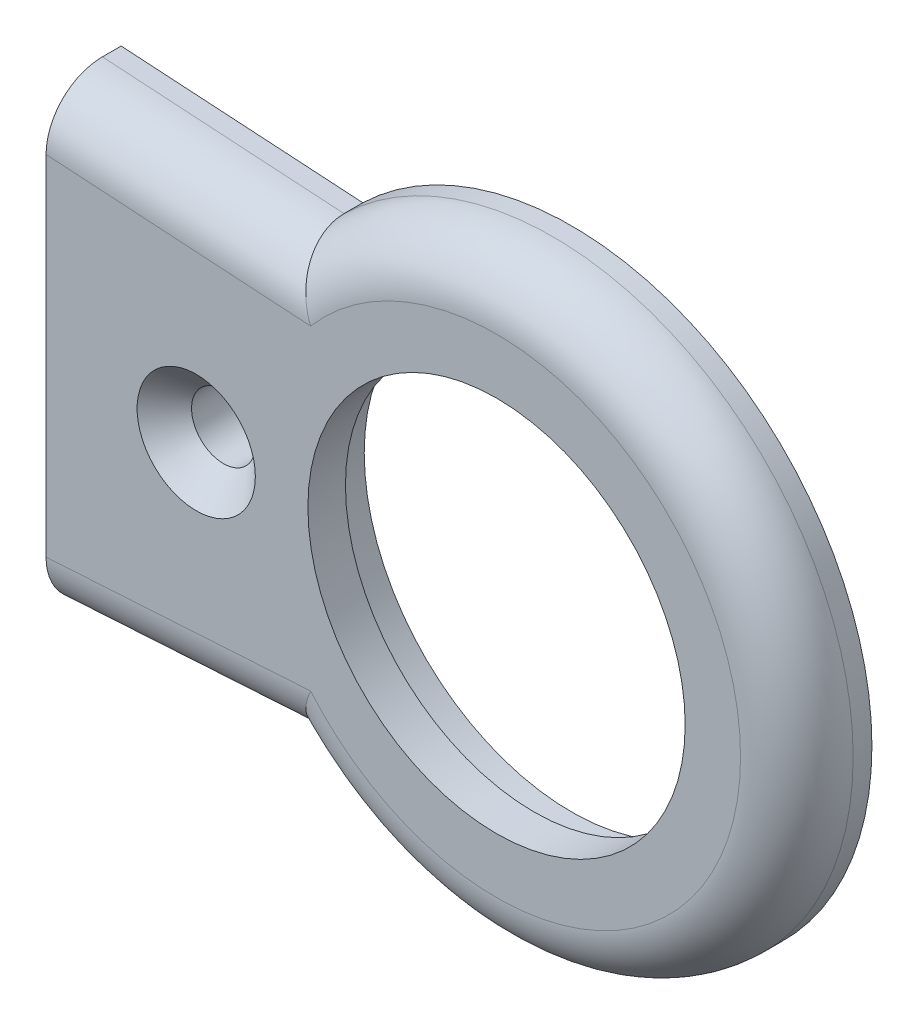
ISO-10303-21;
HEADER;
FILE_DESCRIPTION(('STEP AP214'),'2;1');
FILE_NAME('part.step','',(''),(''),'','','');
FILE_SCHEMA(('AUTOMOTIVE_DESIGN { 1 0 10303 214 1 1 1 1 }'));
ENDSEC;
DATA;
#1=APPLICATION_CONTEXT('core data for automotive mechanical design processes');
#2=APPLICATION_PROTOCOL_DEFINITION('international standard','automotive_design',2000,#1);
#3=PRODUCT_CONTEXT('',#1,'mechanical');
#4=PRODUCT('Part','Part','',(#3));
#5=PRODUCT_RELATED_PRODUCT_CATEGORY('part','',(#4));
#6=PRODUCT_DEFINITION_FORMATION('','',#4);
#7=PRODUCT_DEFINITION_CONTEXT('part definition',#1,'design');
#8=PRODUCT_DEFINITION('design','',#6,#7);
#9=PRODUCT_DEFINITION_SHAPE('','',#8);
#10=(LENGTH_UNIT() NAMED_UNIT(*) SI_UNIT(.MILLI.,.METRE.));
#11=(NAMED_UNIT(*) PLANE_ANGLE_UNIT() SI_UNIT($,.RADIAN.));
#12=(NAMED_UNIT(*) SI_UNIT($,.STERADIAN.) SOLID_ANGLE_UNIT());
#13=UNCERTAINTY_MEASURE_WITH_UNIT(LENGTH_MEASURE(1.E-05),#10,'distance_accuracy_value','');
#14=(GEOMETRIC_REPRESENTATION_CONTEXT(3) GLOBAL_UNCERTAINTY_ASSIGNED_CONTEXT((#13)) GLOBAL_UNIT_ASSIGNED_CONTEXT((#10,
#11,#12)) REPRESENTATION_CONTEXT('',''));
#15=CARTESIAN_POINT('',(0.,0.,0.));
#16=DIRECTION('',(0.,0.,1.));
#17=DIRECTION('',(1.,0.,0.));
#18=AXIS2_PLACEMENT_3D('',#15,#16,#17);
#19=CARTESIAN_POINT('',(141.,-21.1790926800229,7.00000000000001));
#20=DIRECTION('',(-1.,0.,0.));
#21=DIRECTION('',(0.,0.,1.));
#22=AXIS2_PLACEMENT_3D('',#19,#20,#21);
#23=PLANE('',#22);
#24=DIRECTION('',(0.,1.,0.));
#25=VECTOR('',#24,1.);
#26=CARTESIAN_POINT('',(141.,-21.1790926800229,7.00000000000001));
#27=LINE('',#26,#25);
#28=CARTESIAN_POINT('',(141.,-12.2949219386487,7.00000000000001));
#29=VERTEX_POINT('',#28);
#30=CARTESIAN_POINT('',(141.,12.2949219386487,7.00000000000001));
#31=VERTEX_POINT('',#30);
#32=EDGE_CURVE('E11',#29,#31,#27,.T.);
#33=ORIENTED_EDGE('',*,*,#32,.F.);
#34=DIRECTION('',(0.,0.,1.));
#35=VECTOR('',#34,1.);
#36=CARTESIAN_POINT('',(141.,-12.2949219386487,11.));
#37=LINE('',#36,#35);
#38=CARTESIAN_POINT('',(141.,-12.2949219386487,8.));
#39=VERTEX_POINT('',#38);
#40=EDGE_CURVE('E101',#29,#39,#37,.T.);
#41=ORIENTED_EDGE('',*,*,#40,.T.);
#42=CARTESIAN_POINT('',(141.,-9.28920997907761,8.));
#43=DIRECTION('',(-1.,0.,0.));
#44=DIRECTION('',(0.,-1.,0.));
#45=AXIS2_PLACEMENT_3D('',#42,#43,#44);
#46=ELLIPSE('',#45,3.00571195957109,3.);
#47=CARTESIAN_POINT('',(141.,-9.28920997907761,11.));
#48=VERTEX_POINT('',#47);
#49=EDGE_CURVE('E185',#48,#39,#46,.F.);
#50=ORIENTED_EDGE('',*,*,#49,.F.);
#51=DIRECTION('',(0.,-1.,0.));
#52=VECTOR('',#51,1.);
#53=CARTESIAN_POINT('',(141.,0.,11.));
#54=LINE('',#53,#52);
#55=CARTESIAN_POINT('',(141.,9.28920997907761,11.));
#56=VERTEX_POINT('',#55);
#57=EDGE_CURVE('E128',#56,#48,#54,.T.);
#58=ORIENTED_EDGE('',*,*,#57,.F.);
#59=CARTESIAN_POINT('',(141.,9.28920997907761,8.));
#60=DIRECTION('',(-1.,0.,0.));
#61=DIRECTION('',(0.,-1.,0.));
#62=AXIS2_PLACEMENT_3D('',#59,#60,#61);
#63=ELLIPSE('',#62,3.00571195957109,3.);
#64=CARTESIAN_POINT('',(141.,12.2949219386487,8.));
#65=VERTEX_POINT('',#64);
#66=EDGE_CURVE('E134',#65,#56,#63,.F.);
#67=ORIENTED_EDGE('',*,*,#66,.F.);
#68=DIRECTION('',(0.,0.,1.));
#69=VECTOR('',#68,1.);
#70=CARTESIAN_POINT('',(141.,12.2949219386487,11.));
#71=LINE('',#70,#69);
#72=EDGE_CURVE('E109',#31,#65,#71,.T.);
#73=ORIENTED_EDGE('',*,*,#72,.F.);
#74=EDGE_LOOP('',(#33,#41,#50,#58,#67,#73));
#75=FACE_BOUND('',#74,.T.);
#76=ADVANCED_FACE('F50',(#75),#23,.T.);
#77=CARTESIAN_POINT('',(189.05332854238,-21.1790926800229,7.));
#78=DIRECTION('',(0.,0.,-1.));
#79=DIRECTION('',(-1.,0.,0.));
#80=AXIS2_PLACEMENT_3D('',#77,#78,#79);
#81=PLANE('',#80);
#82=CARTESIAN_POINT('',(165.,0.,7.));
#83=DIRECTION('',(0.,0.,-1.));
#84=DIRECTION('',(-1.,0.,0.));
#85=AXIS2_PLACEMENT_3D('',#82,#83,#84);
#86=CIRCLE('',#85,16.);
#87=CARTESIAN_POINT('',(153.875702269357,-11.5,7.));
#88=VERTEX_POINT('',#87);
#89=CARTESIAN_POINT('',(153.875702269357,11.5,7.));
#90=VERTEX_POINT('',#89);
#91=EDGE_CURVE('E125',#88,#90,#86,.F.);
#92=ORIENTED_EDGE('',*,*,#91,.F.);
#93=DIRECTION('',(-0.998099631751839,-0.0616208170737996,0.));
#94=VECTOR('',#93,1.);
#95=CARTESIAN_POINT('',(0.,-21.,7.00000000000002));
#96=LINE('',#95,#94);
#97=EDGE_CURVE('E113',#88,#29,#96,.T.);
#98=ORIENTED_EDGE('',*,*,#97,.T.);
#99=ORIENTED_EDGE('',*,*,#32,.T.);
#100=DIRECTION('',(-0.998099631751839,0.0616208170737996,0.));
#101=VECTOR('',#100,1.);
#102=CARTESIAN_POINT('',(0.,21.,7.00000000000002));
#103=LINE('',#102,#101);
#104=EDGE_CURVE('E192',#90,#31,#103,.T.);
#105=ORIENTED_EDGE('',*,*,#104,.F.);
#106=EDGE_LOOP('',(#92,#98,#99,#105));
#107=FACE_BOUND('',#106,.T.);
#108=CARTESIAN_POINT('',(165.,0.,7.));
#109=DIRECTION('',(0.,0.,-1.));
#110=DIRECTION('',(-1.,0.,0.));
#111=AXIS2_PLACEMENT_3D('',#108,#109,#110);
#112=CIRCLE('',#111,11.05);
#113=CARTESIAN_POINT('',(153.95,0.,7.));
#114=VERTEX_POINT('',#113);
#115=EDGE_CURVE('E184',#114,#114,#112,.T.);
#116=ORIENTED_EDGE('',*,*,#115,.F.);
#117=EDGE_LOOP('',(#116));
#118=FACE_BOUND('',#117,.T.);
#119=CARTESIAN_POINT('',(149.,0.,7.));
#120=DIRECTION('',(0.,0.,1.));
#121=DIRECTION('',(1.,0.,0.));
#122=AXIS2_PLACEMENT_3D('',#119,#120,#121);
#123=CIRCLE('',#122,1.70000000000001);
#124=CARTESIAN_POINT('',(150.7,0.,7.));
#125=VERTEX_POINT('',#124);
#126=EDGE_CURVE('E166',#125,#125,#123,.T.);
#127=ORIENTED_EDGE('',*,*,#126,.T.);
#128=EDGE_LOOP('',(#127));
#129=FACE_BOUND('',#128,.T.);
#130=ADVANCED_FACE('F123',(#107,#118,#129),#81,.T.);
#131=CARTESIAN_POINT('',(165.,0.,0.));
#132=DIRECTION('',(0.,0.,1.));
#133=DIRECTION('',(1.,0.,0.));
#134=AXIS2_PLACEMENT_3D('',#131,#132,#133);
#135=CYLINDRICAL_SURFACE('',#134,10.05);
#136=CARTESIAN_POINT('',(165.,0.,11.));
#137=DIRECTION('',(0.,0.,1.));
#138=DIRECTION('',(1.,0.,0.));
#139=AXIS2_PLACEMENT_3D('',#136,#137,#138);
#140=CIRCLE('',#139,10.05);
#141=CARTESIAN_POINT('',(175.05,0.,11.));
#142=VERTEX_POINT('',#141);
#143=EDGE_CURVE('E158',#142,#142,#140,.T.);
#144=ORIENTED_EDGE('',*,*,#143,.T.);
#145=EDGE_LOOP('',(#144));
#146=FACE_BOUND('',#145,.T.);
#147=CARTESIAN_POINT('',(165.,0.,9.));
#148=DIRECTION('',(0.,0.,1.));
#149=DIRECTION('',(1.,0.,0.));
#150=AXIS2_PLACEMENT_3D('',#147,#148,#149);
#151=CIRCLE('',#150,10.05);
#152=CARTESIAN_POINT('',(175.05,0.,9.));
#153=VERTEX_POINT('',#152);
#154=EDGE_CURVE('E151',#153,#153,#151,.T.);
#155=ORIENTED_EDGE('',*,*,#154,.F.);
#156=EDGE_LOOP('',(#155));
#157=FACE_BOUND('',#156,.T.);
#158=ADVANCED_FACE('F236',(#146,#157),#135,.F.);
#159=CARTESIAN_POINT('',(149.,0.,11.));
#160=DIRECTION('',(0.,0.,1.));
#161=DIRECTION('',(1.,0.,0.));
#162=AXIS2_PLACEMENT_3D('',#159,#160,#161);
#163=CONICAL_SURFACE('',#162,3.14999999999999,0.78539816339744);
#164=CARTESIAN_POINT('',(149.,0.,9.55));
#165=DIRECTION('',(0.,0.,1.));
#166=DIRECTION('',(1.,0.,0.));
#167=AXIS2_PLACEMENT_3D('',#164,#165,#166);
#168=CIRCLE('',#167,1.70000000000001);
#169=CARTESIAN_POINT('',(150.7,0.,9.55));
#170=VERTEX_POINT('',#169);
#171=EDGE_CURVE('E175',#170,#170,#168,.T.);
#172=ORIENTED_EDGE('',*,*,#171,.F.);
#173=EDGE_LOOP('',(#172));
#174=FACE_BOUND('',#173,.T.);
#175=CARTESIAN_POINT('',(149.,0.,11.));
#176=DIRECTION('',(0.,0.,1.));
#177=DIRECTION('',(1.,0.,0.));
#178=AXIS2_PLACEMENT_3D('',#175,#176,#177);
#179=CIRCLE('',#178,3.14999999999999);
#180=CARTESIAN_POINT('',(152.15,0.,11.));
#181=VERTEX_POINT('',#180);
#182=EDGE_CURVE('E60',#181,#181,#179,.T.);
#183=ORIENTED_EDGE('',*,*,#182,.T.);
#184=EDGE_LOOP('',(#183));
#185=FACE_BOUND('',#184,.T.);
#186=ADVANCED_FACE('F237',(#174,#185),#163,.F.);
#187=CARTESIAN_POINT('',(165.,0.,11.));
#188=DIRECTION('',(0.,0.,-1.));
#189=DIRECTION('',(-1.,0.,0.));
#190=AXIS2_PLACEMENT_3D('',#187,#188,#189);
#191=CYLINDRICAL_SURFACE('',#190,16.);
#192=DIRECTION('',(0.,0.,-1.));
#193=VECTOR('',#192,1.);
#194=CARTESIAN_POINT('',(153.875702269357,-11.5,11.));
#195=LINE('',#194,#193);
#196=CARTESIAN_POINT('',(153.875702269357,-11.5,8.));
#197=VERTEX_POINT('',#196);
#198=EDGE_CURVE('E142',#197,#88,#195,.T.);
#199=ORIENTED_EDGE('',*,*,#198,.T.);
#200=ORIENTED_EDGE('',*,*,#91,.T.);
#201=DIRECTION('',(0.,0.,-1.));
#202=VECTOR('',#201,1.);
#203=CARTESIAN_POINT('',(153.875702269357,11.5,11.));
#204=LINE('',#203,#202);
#205=CARTESIAN_POINT('',(153.875702269357,11.5,8.));
#206=VERTEX_POINT('',#205);
#207=EDGE_CURVE('E51',#206,#90,#204,.T.);
#208=ORIENTED_EDGE('',*,*,#207,.F.);
#209=CARTESIAN_POINT('',(165.,0.,8.));
#210=DIRECTION('',(0.,0.,1.));
#211=DIRECTION('',(1.,0.,0.));
#212=AXIS2_PLACEMENT_3D('',#209,#210,#211);
#213=CIRCLE('',#212,16.);
#214=EDGE_CURVE('E138',#206,#197,#213,.F.);
#215=ORIENTED_EDGE('',*,*,#214,.T.);
#216=EDGE_LOOP('',(#199,#200,#208,#215));
#217=FACE_BOUND('',#216,.T.);
#218=ADVANCED_FACE('F191',(#217),#191,.T.);
#219=CARTESIAN_POINT('',(0.,-21.,11.));
#220=DIRECTION('',(-0.0616208170737997,0.998099631751839,0.));
#221=DIRECTION('',(-0.998099631751839,-0.0616208170737997,0.));
#222=AXIS2_PLACEMENT_3D('',#219,#220,#221);
#223=PLANE('',#222);
#224=ORIENTED_EDGE('',*,*,#97,.F.);
#225=ORIENTED_EDGE('',*,*,#198,.F.);
#226=DIRECTION('',(0.998099631751839,0.0616208170737997,0.));
#227=VECTOR('',#226,1.);
#228=CARTESIAN_POINT('',(0.,-21.,8.));
#229=LINE('',#228,#227);
#230=EDGE_CURVE('E120',#197,#39,#229,.F.);
#231=ORIENTED_EDGE('',*,*,#230,.T.);
#232=ORIENTED_EDGE('',*,*,#40,.F.);
#233=EDGE_LOOP('',(#224,#225,#231,#232));
#234=FACE_BOUND('',#233,.T.);
#235=ADVANCED_FACE('F111',(#234),#223,.F.);
#236=CARTESIAN_POINT('',(165.,0.,8.));
#237=DIRECTION('',(0.,0.,1.));
#238=DIRECTION('',(1.,0.,0.));
#239=AXIS2_PLACEMENT_3D('',#236,#237,#238);
#240=TOROIDAL_SURFACE('',#239,13.,3.);
#241=CARTESIAN_POINT('',(153.875702269357,-11.5,8.));
#242=CARTESIAN_POINT('',(153.875698964788,-11.5000116115528,8.07906770920268));
#243=CARTESIAN_POINT('',(153.876885032997,-11.4967954052138,8.15812958437408));
#244=CARTESIAN_POINT('',(153.881610215087,-11.4839963478088,8.31564960643777));
#245=CARTESIAN_POINT('',(153.885148842286,-11.4744148135553,8.39410787480464));
#246=CARTESIAN_POINT('',(153.894540110479,-11.4490101412512,8.54964068177533));
#247=CARTESIAN_POINT('',(153.900386152612,-11.4332048026427,8.62671851676363));
#248=CARTESIAN_POINT('',(153.914337756955,-11.395537509336,8.77914995463957));
#249=CARTESIAN_POINT('',(153.922443360146,-11.3736754447914,8.85450352622867));
#250=CARTESIAN_POINT('',(153.950055791305,-11.2993277977778,9.07714623262864));
#251=CARTESIAN_POINT('',(153.972869704396,-11.2380495382704,9.22120542245443));
#252=CARTESIAN_POINT('',(154.026596360567,-11.0944977616338,9.49671908300243));
#253=CARTESIAN_POINT('',(154.057512311888,-11.0122159278567,9.62816853229648));
#254=CARTESIAN_POINT('',(154.127705448966,-10.8266186229508,9.87965242796991));
#255=CARTESIAN_POINT('',(154.167219542198,-10.7227118471797,9.99918385948195));
#256=CARTESIAN_POINT('',(154.252936829609,-10.4990985786371,10.2195650496596));
#257=CARTESIAN_POINT('',(154.299141876029,-10.3793877116642,10.3204096175985));
#258=CARTESIAN_POINT('',(154.401114447858,-10.1175639792572,10.5092161750602));
#259=CARTESIAN_POINT('',(154.457351488152,-9.97442476142206,10.5954990841514));
#260=CARTESIAN_POINT('',(154.575104015393,-9.67793563008134,10.7435279130555));
#261=CARTESIAN_POINT('',(154.636622783344,-9.52457938321241,10.8052584448937));
#262=CARTESIAN_POINT('',(154.762108986662,-9.21538412802384,10.9025527386063));
#263=CARTESIAN_POINT('',(154.825984523077,-9.05968884815545,10.9386989894529));
#264=CARTESIAN_POINT('',(154.956257995712,-8.7459370759263,10.9871088366346));
#265=CARTESIAN_POINT('',(155.02265058602,-8.58788597779169,10.9994204433113));
#266=CARTESIAN_POINT('',(155.091265444943,-8.4265551591835,10.9999933533618));
#267=CARTESIAN_POINT('',(155.092863220434,-8.42279949177077,11.0000000143476));
#268=CARTESIAN_POINT('',(155.094461341497,-8.41904411942922,11.));
#269=B_SPLINE_CURVE_WITH_KNOTS('',3,(#241,#242,#243,#244,#245,#246,#247,#248,#249,#250,#251,
#252,#253,#254,#255,#256,#257,#258,#259,#260,#261,#262,#263,#264,#265,#266,#267,#268),
.UNSPECIFIED.,.F.,.F.,(4,2,2,2,2,2,2,2,2,2,2,2,2,4),(0.,0.237118878541134,0.474188718930809,
0.710585431345083,0.946986431392889,1.41922274047785,1.89164632872818,2.37926198322606,
2.86701288235107,3.39383541917708,3.92098761880903,4.4357141092721,4.94940269823586,
4.96164692441696),.UNSPECIFIED.);
#270=CARTESIAN_POINT('',(155.094461341497,-8.41904411942921,11.));
#271=VERTEX_POINT('',#270);
#272=EDGE_CURVE('E167',#271,#197,#269,.F.);
#273=ORIENTED_EDGE('',*,*,#272,.T.);
#274=ORIENTED_EDGE('',*,*,#214,.F.);
#275=CARTESIAN_POINT('',(153.875702269357,11.5,8.));
#276=CARTESIAN_POINT('',(153.875698964788,11.5000116115528,8.07906770920268));
#277=CARTESIAN_POINT('',(153.876885032997,11.4967954052138,8.15812958437408));
#278=CARTESIAN_POINT('',(153.881610215087,11.4839963478088,8.31564960643777));
#279=CARTESIAN_POINT('',(153.885148842286,11.4744148135553,8.39410787480464));
#280=CARTESIAN_POINT('',(153.894540110479,11.4490101412512,8.54964068177533));
#281=CARTESIAN_POINT('',(153.900386152612,11.4332048026427,8.62671851676363));
#282=CARTESIAN_POINT('',(153.914337756955,11.395537509336,8.77914995463957));
#283=CARTESIAN_POINT('',(153.922443360146,11.3736754447914,8.85450352622867));
#284=CARTESIAN_POINT('',(153.950055791305,11.2993277977778,9.07714623262864));
#285=CARTESIAN_POINT('',(153.972869704396,11.2380495382704,9.22120542245442));
#286=CARTESIAN_POINT('',(154.026596360567,11.0944977616338,9.49671908300243));
#287=CARTESIAN_POINT('',(154.057512311888,11.0122159278567,9.62816853229648));
#288=CARTESIAN_POINT('',(154.127705448966,10.8266186229508,9.87965242796992));
#289=CARTESIAN_POINT('',(154.167219542198,10.7227118471797,9.99918385948195));
#290=CARTESIAN_POINT('',(154.252936829609,10.4990985786371,10.2195650496596));
#291=CARTESIAN_POINT('',(154.299141876029,10.3793877116642,10.3204096175985));
#292=CARTESIAN_POINT('',(154.401114447858,10.1175639792572,10.5092161750603));
#293=CARTESIAN_POINT('',(154.457351488152,9.97442476142205,10.5954990841514));
#294=CARTESIAN_POINT('',(154.575104015393,9.67793563008134,10.7435279130555));
#295=CARTESIAN_POINT('',(154.636622783344,9.52457938321242,10.8052584448937));
#296=CARTESIAN_POINT('',(154.762108986662,9.21538412802383,10.9025527386062));
#297=CARTESIAN_POINT('',(154.825984523076,9.05968884815542,10.9386989894529));
#298=CARTESIAN_POINT('',(154.956257995713,8.74593707592636,10.9871088366346));
#299=CARTESIAN_POINT('',(155.02265058602,8.58788597779187,10.9994204433113));
#300=CARTESIAN_POINT('',(155.091265444943,8.42655515918353,10.9999933533618));
#301=CARTESIAN_POINT('',(155.092863220434,8.42279949177079,11.0000000143476));
#302=CARTESIAN_POINT('',(155.094461341497,8.41904411942925,11.));
#303=B_SPLINE_CURVE_WITH_KNOTS('',3,(#275,#276,#277,#278,#279,#280,#281,#282,#283,#284,#285,
#286,#287,#288,#289,#290,#291,#292,#293,#294,#295,#296,#297,#298,#299,#300,#301,#302),
.UNSPECIFIED.,.F.,.F.,(4,2,2,2,2,2,2,2,2,2,2,2,2,4),(0.,0.237118878541134,0.474188718930807,
0.710585431345082,0.946986431392889,1.41922274047785,1.89164632872818,2.37926198322606,
2.86701288235107,3.39383541917708,3.92098761880903,4.43571410927209,4.94940269823583,
4.96164692441693),.UNSPECIFIED.);
#304=CARTESIAN_POINT('',(155.094461341497,8.4190441194292,11.));
#305=VERTEX_POINT('',#304);
#306=EDGE_CURVE('E171',#305,#206,#303,.F.);
#307=ORIENTED_EDGE('',*,*,#306,.F.);
#308=CARTESIAN_POINT('',(165.,0.,11.));
#309=DIRECTION('',(0.,0.,1.));
#310=DIRECTION('',(1.,0.,0.));
#311=AXIS2_PLACEMENT_3D('',#308,#309,#310);
#312=CIRCLE('',#311,13.);
#313=EDGE_CURVE('E63',#271,#305,#312,.T.);
#314=ORIENTED_EDGE('',*,*,#313,.F.);
#315=EDGE_LOOP('',(#273,#274,#307,#314));
#316=FACE_BOUND('',#315,.T.);
#317=ADVANCED_FACE('F200',(#316),#240,.T.);
#318=CARTESIAN_POINT('',(0.,0.,11.));
#319=DIRECTION('',(0.,0.,1.));
#320=DIRECTION('',(1.,0.,0.));
#321=AXIS2_PLACEMENT_3D('',#318,#319,#320);
#322=PLANE('',#321);
#323=ORIENTED_EDGE('',*,*,#182,.F.);
#324=EDGE_LOOP('',(#323));
#325=FACE_BOUND('',#324,.T.);
#326=ORIENTED_EDGE('',*,*,#143,.F.);
#327=EDGE_LOOP('',(#326));
#328=FACE_BOUND('',#327,.T.);
#329=DIRECTION('',(0.998099631751839,-0.0616208170737997,0.));
#330=VECTOR('',#329,1.);
#331=CARTESIAN_POINT('',(1.10671556020035,17.9259614777108,11.));
#332=LINE('',#331,#330);
#333=EDGE_CURVE('E141',#305,#56,#332,.F.);
#334=ORIENTED_EDGE('',*,*,#333,.T.);
#335=ORIENTED_EDGE('',*,*,#57,.T.);
#336=DIRECTION('',(0.998099631751839,0.0616208170737997,0.));
#337=VECTOR('',#336,1.);
#338=CARTESIAN_POINT('',(153.690839818135,-8.50570110474448,11.));
#339=LINE('',#338,#337);
#340=EDGE_CURVE('E68',#48,#271,#339,.T.);
#341=ORIENTED_EDGE('',*,*,#340,.T.);
#342=ORIENTED_EDGE('',*,*,#313,.T.);
#343=EDGE_LOOP('',(#334,#335,#341,#342));
#344=FACE_BOUND('',#343,.T.);
#345=ADVANCED_FACE('F224',(#325,#328,#344),#322,.T.);
#346=CARTESIAN_POINT('',(0.,21.,11.));
#347=DIRECTION('',(0.0616208170737997,0.998099631751839,0.));
#348=DIRECTION('',(-0.998099631751839,0.0616208170737997,0.));
#349=AXIS2_PLACEMENT_3D('',#346,#347,#348);
#350=PLANE('',#349);
#351=ORIENTED_EDGE('',*,*,#207,.T.);
#352=ORIENTED_EDGE('',*,*,#104,.T.);
#353=ORIENTED_EDGE('',*,*,#72,.T.);
#354=DIRECTION('',(0.998099631751839,-0.0616208170737997,0.));
#355=VECTOR('',#354,1.);
#356=CARTESIAN_POINT('',(0.,21.,8.));
#357=LINE('',#356,#355);
#358=EDGE_CURVE('E135',#65,#206,#357,.T.);
#359=ORIENTED_EDGE('',*,*,#358,.T.);
#360=EDGE_LOOP('',(#351,#352,#353,#359));
#361=FACE_BOUND('',#360,.T.);
#362=ADVANCED_FACE('F248',(#361),#350,.T.);
#363=CARTESIAN_POINT('',(-0.184862451221399,18.0057011047445,8.));
#364=DIRECTION('',(0.998099631751839,-0.0616208170737997,0.));
#365=DIRECTION('',(0.0616208170737997,0.998099631751839,0.));
#366=AXIS2_PLACEMENT_3D('',#363,#364,#365);
#367=CYLINDRICAL_SURFACE('',#366,3.);
#368=ORIENTED_EDGE('',*,*,#358,.F.);
#369=ORIENTED_EDGE('',*,*,#66,.T.);
#370=ORIENTED_EDGE('',*,*,#333,.F.);
#371=ORIENTED_EDGE('',*,*,#306,.T.);
#372=EDGE_LOOP('',(#368,#369,#370,#371));
#373=FACE_BOUND('',#372,.T.);
#374=ADVANCED_FACE('F204',(#373),#367,.T.);
#375=CARTESIAN_POINT('',(1.10671556020035,-17.9259614777108,8.));
#376=DIRECTION('',(-0.998099631751839,-0.0616208170737997,0.));
#377=DIRECTION('',(0.0616208170737997,-0.998099631751839,0.));
#378=AXIS2_PLACEMENT_3D('',#375,#376,#377);
#379=CYLINDRICAL_SURFACE('',#378,3.);
#380=ORIENTED_EDGE('',*,*,#340,.F.);
#381=ORIENTED_EDGE('',*,*,#49,.T.);
#382=ORIENTED_EDGE('',*,*,#230,.F.);
#383=ORIENTED_EDGE('',*,*,#272,.F.);
#384=EDGE_LOOP('',(#380,#381,#382,#383));
#385=FACE_BOUND('',#384,.T.);
#386=ADVANCED_FACE('F233',(#385),#379,.T.);
#387=CARTESIAN_POINT('',(149.,0.,11.));
#388=DIRECTION('',(0.,0.,1.));
#389=DIRECTION('',(1.,0.,0.));
#390=AXIS2_PLACEMENT_3D('',#387,#388,#389);
#391=CYLINDRICAL_SURFACE('',#390,1.70000000000001);
#392=ORIENTED_EDGE('',*,*,#126,.F.);
#393=EDGE_LOOP('',(#392));
#394=FACE_BOUND('',#393,.T.);
#395=ORIENTED_EDGE('',*,*,#171,.T.);
#396=EDGE_LOOP('',(#395));
#397=FACE_BOUND('',#396,.T.);
#398=ADVANCED_FACE('F229',(#394,#397),#391,.F.);
#399=CARTESIAN_POINT('',(0.,0.,9.));
#400=DIRECTION('',(0.,0.,1.));
#401=DIRECTION('',(1.,0.,0.));
#402=AXIS2_PLACEMENT_3D('',#399,#400,#401);
#403=PLANE('',#402);
#404=ORIENTED_EDGE('',*,*,#154,.T.);
#405=EDGE_LOOP('',(#404));
#406=FACE_BOUND('',#405,.T.);
#407=CARTESIAN_POINT('',(165.,0.,9.));
#408=DIRECTION('',(0.,0.,1.));
#409=DIRECTION('',(1.,0.,0.));
#410=AXIS2_PLACEMENT_3D('',#407,#408,#409);
#411=CIRCLE('',#410,11.05);
#412=CARTESIAN_POINT('',(176.05,0.,9.));
#413=VERTEX_POINT('',#412);
#414=EDGE_CURVE('E146',#413,#413,#411,.T.);
#415=ORIENTED_EDGE('',*,*,#414,.F.);
#416=EDGE_LOOP('',(#415));
#417=FACE_BOUND('',#416,.T.);
#418=ADVANCED_FACE('F226',(#406,#417),#403,.F.);
#419=CARTESIAN_POINT('',(165.,0.,42.2541197284454));
#420=DIRECTION('',(0.,0.,-1.));
#421=DIRECTION('',(-1.,0.,0.));
#422=AXIS2_PLACEMENT_3D('',#419,#420,#421);
#423=CYLINDRICAL_SURFACE('',#422,11.05);
#424=ORIENTED_EDGE('',*,*,#414,.T.);
#425=EDGE_LOOP('',(#424));
#426=FACE_BOUND('',#425,.T.);
#427=ORIENTED_EDGE('',*,*,#115,.T.);
#428=EDGE_LOOP('',(#427));
#429=FACE_BOUND('',#428,.T.);
#430=ADVANCED_FACE('F47',(#426,#429),#423,.F.);
#431=CLOSED_SHELL('',(#76,#130,#158,#186,#218,#235,#317,#345,#362,#374,#386,#398,#418,#430));
#432=MANIFOLD_SOLID_BREP('B2',#431);
#433=ADVANCED_BREP_SHAPE_REPRESENTATION('',(#18,#432),#14);
#434=SHAPE_DEFINITION_REPRESENTATION(#9,#433);
ENDSEC;
END-ISO-10303-21;
